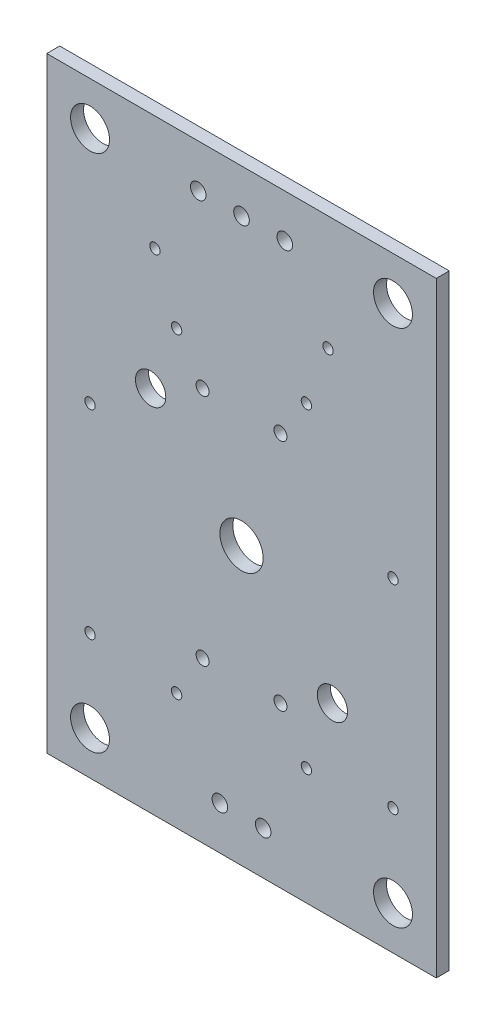
ISO-10303-21;
HEADER;
FILE_DESCRIPTION(('STEP AP214'),'2;1');
FILE_NAME('part.step','',(''),(''),'','','');
FILE_SCHEMA(('AUTOMOTIVE_DESIGN { 1 0 10303 214 1 1 1 1 }'));
ENDSEC;
DATA;
#1=APPLICATION_CONTEXT('core data for automotive mechanical design processes');
#2=APPLICATION_PROTOCOL_DEFINITION('international standard','automotive_design',2000,#1);
#3=PRODUCT_CONTEXT('',#1,'mechanical');
#4=PRODUCT('Part','Part','',(#3));
#5=PRODUCT_RELATED_PRODUCT_CATEGORY('part','',(#4));
#6=PRODUCT_DEFINITION_FORMATION('','',#4);
#7=PRODUCT_DEFINITION_CONTEXT('part definition',#1,'design');
#8=PRODUCT_DEFINITION('design','',#6,#7);
#9=PRODUCT_DEFINITION_SHAPE('','',#8);
#10=(LENGTH_UNIT() NAMED_UNIT(*) SI_UNIT(.MILLI.,.METRE.));
#11=(NAMED_UNIT(*) PLANE_ANGLE_UNIT() SI_UNIT($,.RADIAN.));
#12=(NAMED_UNIT(*) SI_UNIT($,.STERADIAN.) SOLID_ANGLE_UNIT());
#13=UNCERTAINTY_MEASURE_WITH_UNIT(LENGTH_MEASURE(1.E-05),#10,'distance_accuracy_value','');
#14=(GEOMETRIC_REPRESENTATION_CONTEXT(3) GLOBAL_UNCERTAINTY_ASSIGNED_CONTEXT((#13)) GLOBAL_UNIT_ASSIGNED_CONTEXT((#10,
#11,#12)) REPRESENTATION_CONTEXT('',''));
#15=CARTESIAN_POINT('',(0.,0.,0.));
#16=DIRECTION('',(0.,0.,1.));
#17=DIRECTION('',(1.,0.,0.));
#18=AXIS2_PLACEMENT_3D('',#15,#16,#17);
#19=CARTESIAN_POINT('',(-22.5,35.,1.5));
#20=DIRECTION('',(0.,0.,-1.));
#21=DIRECTION('',(-1.,0.,0.));
#22=AXIS2_PLACEMENT_3D('',#19,#20,#21);
#23=PLANE('',#22);
#24=CARTESIAN_POINT('',(9.99999999999999,21.75,1.5));
#25=DIRECTION('',(0.,0.,1.));
#26=DIRECTION('',(-1.,0.,0.));
#27=AXIS2_PLACEMENT_3D('',#24,#25,#26);
#28=CIRCLE('',#27,0.6);
#29=CARTESIAN_POINT('',(9.4,21.75,1.5));
#30=VERTEX_POINT('',#29);
#31=EDGE_CURVE('E262',#30,#30,#28,.T.);
#32=ORIENTED_EDGE('',*,*,#31,.F.);
#33=EDGE_LOOP('',(#32));
#34=FACE_BOUND('',#33,.T.);
#35=CARTESIAN_POINT('',(-9.99999999999999,21.75,1.5));
#36=DIRECTION('',(0.,0.,1.));
#37=DIRECTION('',(1.,0.,0.));
#38=AXIS2_PLACEMENT_3D('',#35,#36,#37);
#39=CIRCLE('',#38,0.6);
#40=CARTESIAN_POINT('',(-9.4,21.75,1.5));
#41=VERTEX_POINT('',#40);
#42=EDGE_CURVE('E256',#41,#41,#39,.T.);
#43=ORIENTED_EDGE('',*,*,#42,.F.);
#44=EDGE_LOOP('',(#43));
#45=FACE_BOUND('',#44,.T.);
#46=CARTESIAN_POINT('',(7.5,15.,1.5));
#47=DIRECTION('',(0.,0.,1.));
#48=DIRECTION('',(1.,0.,0.));
#49=AXIS2_PLACEMENT_3D('',#46,#47,#48);
#50=CIRCLE('',#49,0.6);
#51=CARTESIAN_POINT('',(8.1,15.,1.5));
#52=VERTEX_POINT('',#51);
#53=EDGE_CURVE('E250',#52,#52,#50,.T.);
#54=ORIENTED_EDGE('',*,*,#53,.F.);
#55=EDGE_LOOP('',(#54));
#56=FACE_BOUND('',#55,.T.);
#57=CARTESIAN_POINT('',(-7.5,15.,1.5));
#58=DIRECTION('',(0.,0.,1.));
#59=DIRECTION('',(1.,0.,0.));
#60=AXIS2_PLACEMENT_3D('',#57,#58,#59);
#61=CIRCLE('',#60,0.6);
#62=CARTESIAN_POINT('',(-6.9,15.,1.5));
#63=VERTEX_POINT('',#62);
#64=EDGE_CURVE('E244',#63,#63,#61,.T.);
#65=ORIENTED_EDGE('',*,*,#64,.F.);
#66=EDGE_LOOP('',(#65));
#67=FACE_BOUND('',#66,.T.);
#68=CARTESIAN_POINT('',(7.5,-21.5,1.5));
#69=DIRECTION('',(0.,0.,1.));
#70=DIRECTION('',(1.,0.,0.));
#71=AXIS2_PLACEMENT_3D('',#68,#69,#70);
#72=CIRCLE('',#71,0.6);
#73=CARTESIAN_POINT('',(8.1,-21.5,1.5));
#74=VERTEX_POINT('',#73);
#75=EDGE_CURVE('E238',#74,#74,#72,.T.);
#76=ORIENTED_EDGE('',*,*,#75,.F.);
#77=EDGE_LOOP('',(#76));
#78=FACE_BOUND('',#77,.T.);
#79=CARTESIAN_POINT('',(-7.5,-21.5,1.5));
#80=DIRECTION('',(0.,0.,1.));
#81=DIRECTION('',(1.,0.,0.));
#82=AXIS2_PLACEMENT_3D('',#79,#80,#81);
#83=CIRCLE('',#82,0.6);
#84=CARTESIAN_POINT('',(-6.9,-21.5,1.5));
#85=VERTEX_POINT('',#84);
#86=EDGE_CURVE('E232',#85,#85,#83,.T.);
#87=ORIENTED_EDGE('',*,*,#86,.F.);
#88=EDGE_LOOP('',(#87));
#89=FACE_BOUND('',#88,.T.);
#90=CARTESIAN_POINT('',(17.5,-20.5,1.5));
#91=DIRECTION('',(0.,0.,1.));
#92=DIRECTION('',(-1.,0.,0.));
#93=AXIS2_PLACEMENT_3D('',#90,#91,#92);
#94=CIRCLE('',#93,0.6);
#95=CARTESIAN_POINT('',(16.9,-20.5,1.5));
#96=VERTEX_POINT('',#95);
#97=EDGE_CURVE('E226',#96,#96,#94,.T.);
#98=ORIENTED_EDGE('',*,*,#97,.F.);
#99=EDGE_LOOP('',(#98));
#100=FACE_BOUND('',#99,.T.);
#101=CARTESIAN_POINT('',(17.5,2.49999999999999,1.5));
#102=DIRECTION('',(0.,0.,1.));
#103=DIRECTION('',(-1.,0.,0.));
#104=AXIS2_PLACEMENT_3D('',#101,#102,#103);
#105=CIRCLE('',#104,0.6);
#106=CARTESIAN_POINT('',(16.9,2.49999999999999,1.5));
#107=VERTEX_POINT('',#106);
#108=EDGE_CURVE('E220',#107,#107,#105,.T.);
#109=ORIENTED_EDGE('',*,*,#108,.F.);
#110=EDGE_LOOP('',(#109));
#111=FACE_BOUND('',#110,.T.);
#112=CARTESIAN_POINT('',(-17.5,2.5,1.5));
#113=DIRECTION('',(0.,0.,1.));
#114=DIRECTION('',(1.,0.,0.));
#115=AXIS2_PLACEMENT_3D('',#112,#113,#114);
#116=CIRCLE('',#115,0.6);
#117=CARTESIAN_POINT('',(-16.9,2.5,1.5));
#118=VERTEX_POINT('',#117);
#119=EDGE_CURVE('E214',#118,#118,#116,.T.);
#120=ORIENTED_EDGE('',*,*,#119,.F.);
#121=EDGE_LOOP('',(#120));
#122=FACE_BOUND('',#121,.T.);
#123=CARTESIAN_POINT('',(-17.5,-20.5,1.5));
#124=DIRECTION('',(0.,0.,1.));
#125=DIRECTION('',(1.,0.,0.));
#126=AXIS2_PLACEMENT_3D('',#123,#124,#125);
#127=CIRCLE('',#126,0.6);
#128=CARTESIAN_POINT('',(-16.9,-20.5,1.5));
#129=VERTEX_POINT('',#128);
#130=EDGE_CURVE('E208',#129,#129,#127,.T.);
#131=ORIENTED_EDGE('',*,*,#130,.F.);
#132=EDGE_LOOP('',(#131));
#133=FACE_BOUND('',#132,.T.);
#134=CARTESIAN_POINT('',(4.5,-16.5,1.5));
#135=DIRECTION('',(0.,0.,1.));
#136=DIRECTION('',(-1.,0.,0.));
#137=AXIS2_PLACEMENT_3D('',#134,#135,#136);
#138=CIRCLE('',#137,0.75);
#139=CARTESIAN_POINT('',(3.75,-16.5,1.5));
#140=VERTEX_POINT('',#139);
#141=EDGE_CURVE('E193',#140,#140,#138,.T.);
#142=ORIENTED_EDGE('',*,*,#141,.F.);
#143=EDGE_LOOP('',(#142));
#144=FACE_BOUND('',#143,.T.);
#145=CARTESIAN_POINT('',(2.5,-30.,1.5));
#146=DIRECTION('',(0.,0.,1.));
#147=DIRECTION('',(1.,0.,0.));
#148=AXIS2_PLACEMENT_3D('',#145,#146,#147);
#149=CIRCLE('',#148,0.9);
#150=CARTESIAN_POINT('',(3.4,-30.,1.5));
#151=VERTEX_POINT('',#150);
#152=EDGE_CURVE('E181',#151,#151,#149,.T.);
#153=ORIENTED_EDGE('',*,*,#152,.F.);
#154=EDGE_LOOP('',(#153));
#155=FACE_BOUND('',#154,.T.);
#156=CARTESIAN_POINT('',(5.,30.,1.5));
#157=DIRECTION('',(0.,0.,1.));
#158=DIRECTION('',(1.,0.,0.));
#159=AXIS2_PLACEMENT_3D('',#156,#157,#158);
#160=CIRCLE('',#159,0.9);
#161=CARTESIAN_POINT('',(5.9,30.,1.5));
#162=VERTEX_POINT('',#161);
#163=EDGE_CURVE('E169',#162,#162,#160,.T.);
#164=ORIENTED_EDGE('',*,*,#163,.F.);
#165=EDGE_LOOP('',(#164));
#166=FACE_BOUND('',#165,.T.);
#167=CARTESIAN_POINT('',(-2.5,-30.,1.5));
#168=DIRECTION('',(0.,0.,1.));
#169=DIRECTION('',(1.,0.,0.));
#170=AXIS2_PLACEMENT_3D('',#167,#168,#169);
#171=CIRCLE('',#170,0.9);
#172=CARTESIAN_POINT('',(-1.6,-30.,1.5));
#173=VERTEX_POINT('',#172);
#174=EDGE_CURVE('E157',#173,#173,#171,.T.);
#175=ORIENTED_EDGE('',*,*,#174,.F.);
#176=EDGE_LOOP('',(#175));
#177=FACE_BOUND('',#176,.T.);
#178=CARTESIAN_POINT('',(10.5,-13.5,1.5));
#179=DIRECTION('',(0.,0.,1.));
#180=DIRECTION('',(1.,0.,0.));
#181=AXIS2_PLACEMENT_3D('',#178,#179,#180);
#182=CIRCLE('',#181,1.75);
#183=CARTESIAN_POINT('',(12.25,-13.5,1.5));
#184=VERTEX_POINT('',#183);
#185=EDGE_CURVE('E145',#184,#184,#182,.T.);
#186=ORIENTED_EDGE('',*,*,#185,.F.);
#187=EDGE_LOOP('',(#186));
#188=FACE_BOUND('',#187,.T.);
#189=CARTESIAN_POINT('',(0.,-3.,1.5));
#190=DIRECTION('',(0.,0.,1.));
#191=DIRECTION('',(1.,0.,0.));
#192=AXIS2_PLACEMENT_3D('',#189,#190,#191);
#193=CIRCLE('',#192,2.5);
#194=CARTESIAN_POINT('',(2.5,-3.,1.5));
#195=VERTEX_POINT('',#194);
#196=EDGE_CURVE('E133',#195,#195,#193,.T.);
#197=ORIENTED_EDGE('',*,*,#196,.F.);
#198=EDGE_LOOP('',(#197));
#199=FACE_BOUND('',#198,.T.);
#200=CARTESIAN_POINT('',(17.5,-30.,1.5));
#201=DIRECTION('',(0.,0.,1.));
#202=DIRECTION('',(1.,0.,0.));
#203=AXIS2_PLACEMENT_3D('',#200,#201,#202);
#204=CIRCLE('',#203,2.25);
#205=CARTESIAN_POINT('',(19.75,-30.,1.5));
#206=VERTEX_POINT('',#205);
#207=EDGE_CURVE('E121',#206,#206,#204,.T.);
#208=ORIENTED_EDGE('',*,*,#207,.F.);
#209=EDGE_LOOP('',(#208));
#210=FACE_BOUND('',#209,.T.);
#211=CARTESIAN_POINT('',(-17.5,30.,1.5));
#212=DIRECTION('',(0.,0.,1.));
#213=DIRECTION('',(1.,0.,0.));
#214=AXIS2_PLACEMENT_3D('',#211,#212,#213);
#215=CIRCLE('',#214,2.25);
#216=CARTESIAN_POINT('',(-15.25,30.,1.5));
#217=VERTEX_POINT('',#216);
#218=EDGE_CURVE('E100',#217,#217,#215,.T.);
#219=ORIENTED_EDGE('',*,*,#218,.F.);
#220=EDGE_LOOP('',(#219));
#221=FACE_BOUND('',#220,.T.);
#222=DIRECTION('',(0.,-1.,0.));
#223=VECTOR('',#222,1.);
#224=CARTESIAN_POINT('',(-22.5,-35.,1.5));
#225=LINE('',#224,#223);
#226=CARTESIAN_POINT('',(-22.5,35.,1.5));
#227=VERTEX_POINT('',#226);
#228=CARTESIAN_POINT('',(-22.5,-35.,1.5));
#229=VERTEX_POINT('',#228);
#230=EDGE_CURVE('E85',#227,#229,#225,.T.);
#231=ORIENTED_EDGE('',*,*,#230,.T.);
#232=DIRECTION('',(1.,0.,0.));
#233=VECTOR('',#232,1.);
#234=CARTESIAN_POINT('',(-22.5,-35.,1.5));
#235=LINE('',#234,#233);
#236=CARTESIAN_POINT('',(22.5,-35.,1.5));
#237=VERTEX_POINT('',#236);
#238=EDGE_CURVE('E80',#229,#237,#235,.T.);
#239=ORIENTED_EDGE('',*,*,#238,.T.);
#240=DIRECTION('',(0.,1.,0.));
#241=VECTOR('',#240,1.);
#242=CARTESIAN_POINT('',(22.5,-35.,1.5));
#243=LINE('',#242,#241);
#244=CARTESIAN_POINT('',(22.5,35.,1.5));
#245=VERTEX_POINT('',#244);
#246=EDGE_CURVE('E83',#237,#245,#243,.T.);
#247=ORIENTED_EDGE('',*,*,#246,.T.);
#248=DIRECTION('',(-1.,0.,0.));
#249=VECTOR('',#248,1.);
#250=CARTESIAN_POINT('',(-22.5,35.,1.5));
#251=LINE('',#250,#249);
#252=EDGE_CURVE('E50',#245,#227,#251,.T.);
#253=ORIENTED_EDGE('',*,*,#252,.T.);
#254=EDGE_LOOP('',(#231,#239,#247,#253));
#255=FACE_BOUND('',#254,.T.);
#256=CARTESIAN_POINT('',(17.5,30.,1.5));
#257=DIRECTION('',(0.,0.,1.));
#258=DIRECTION('',(-1.,0.,0.));
#259=AXIS2_PLACEMENT_3D('',#256,#257,#258);
#260=CIRCLE('',#259,2.25);
#261=CARTESIAN_POINT('',(15.25,30.,1.5));
#262=VERTEX_POINT('',#261);
#263=EDGE_CURVE('E115',#262,#262,#260,.T.);
#264=ORIENTED_EDGE('',*,*,#263,.F.);
#265=EDGE_LOOP('',(#264));
#266=FACE_BOUND('',#265,.T.);
#267=CARTESIAN_POINT('',(-17.5,-30.,1.5));
#268=DIRECTION('',(0.,0.,1.));
#269=DIRECTION('',(-1.,0.,0.));
#270=AXIS2_PLACEMENT_3D('',#267,#268,#269);
#271=CIRCLE('',#270,2.25);
#272=CARTESIAN_POINT('',(-19.75,-30.,1.5));
#273=VERTEX_POINT('',#272);
#274=EDGE_CURVE('E127',#273,#273,#271,.T.);
#275=ORIENTED_EDGE('',*,*,#274,.F.);
#276=EDGE_LOOP('',(#275));
#277=FACE_BOUND('',#276,.T.);
#278=CARTESIAN_POINT('',(-10.5,7.5,1.5));
#279=DIRECTION('',(0.,0.,1.));
#280=DIRECTION('',(1.,0.,0.));
#281=AXIS2_PLACEMENT_3D('',#278,#279,#280);
#282=CIRCLE('',#281,1.75);
#283=CARTESIAN_POINT('',(-8.75,7.5,1.5));
#284=VERTEX_POINT('',#283);
#285=EDGE_CURVE('E139',#284,#284,#282,.T.);
#286=ORIENTED_EDGE('',*,*,#285,.F.);
#287=EDGE_LOOP('',(#286));
#288=FACE_BOUND('',#287,.T.);
#289=CARTESIAN_POINT('',(-5.,30.,1.5));
#290=DIRECTION('',(0.,0.,1.));
#291=DIRECTION('',(1.,0.,0.));
#292=AXIS2_PLACEMENT_3D('',#289,#290,#291);
#293=CIRCLE('',#292,0.9);
#294=CARTESIAN_POINT('',(-4.1,30.,1.5));
#295=VERTEX_POINT('',#294);
#296=EDGE_CURVE('E151',#295,#295,#293,.T.);
#297=ORIENTED_EDGE('',*,*,#296,.F.);
#298=EDGE_LOOP('',(#297));
#299=FACE_BOUND('',#298,.T.);
#300=CARTESIAN_POINT('',(0.,30.,1.5));
#301=DIRECTION('',(0.,0.,1.));
#302=DIRECTION('',(1.,0.,0.));
#303=AXIS2_PLACEMENT_3D('',#300,#301,#302);
#304=CIRCLE('',#303,0.9);
#305=CARTESIAN_POINT('',(0.900000000000002,30.,1.5));
#306=VERTEX_POINT('',#305);
#307=EDGE_CURVE('E163',#306,#306,#304,.T.);
#308=ORIENTED_EDGE('',*,*,#307,.F.);
#309=EDGE_LOOP('',(#308));
#310=FACE_BOUND('',#309,.T.);
#311=CARTESIAN_POINT('',(-4.5,-16.5,1.5));
#312=DIRECTION('',(0.,0.,1.));
#313=DIRECTION('',(1.,0.,0.));
#314=AXIS2_PLACEMENT_3D('',#311,#312,#313);
#315=CIRCLE('',#314,0.75);
#316=CARTESIAN_POINT('',(-3.75,-16.5,1.5));
#317=VERTEX_POINT('',#316);
#318=EDGE_CURVE('E175',#317,#317,#315,.T.);
#319=ORIENTED_EDGE('',*,*,#318,.F.);
#320=EDGE_LOOP('',(#319));
#321=FACE_BOUND('',#320,.T.);
#322=CARTESIAN_POINT('',(-4.5,10.5,1.5));
#323=DIRECTION('',(0.,0.,1.));
#324=DIRECTION('',(1.,0.,0.));
#325=AXIS2_PLACEMENT_3D('',#322,#323,#324);
#326=CIRCLE('',#325,0.75);
#327=CARTESIAN_POINT('',(-3.75,10.5,1.5));
#328=VERTEX_POINT('',#327);
#329=EDGE_CURVE('E187',#328,#328,#326,.T.);
#330=ORIENTED_EDGE('',*,*,#329,.F.);
#331=EDGE_LOOP('',(#330));
#332=FACE_BOUND('',#331,.T.);
#333=CARTESIAN_POINT('',(4.5,10.5,1.5));
#334=DIRECTION('',(0.,0.,1.));
#335=DIRECTION('',(-1.,0.,0.));
#336=AXIS2_PLACEMENT_3D('',#333,#334,#335);
#337=CIRCLE('',#336,0.75);
#338=CARTESIAN_POINT('',(3.75,10.5,1.5));
#339=VERTEX_POINT('',#338);
#340=EDGE_CURVE('E199',#339,#339,#337,.T.);
#341=ORIENTED_EDGE('',*,*,#340,.F.);
#342=EDGE_LOOP('',(#341));
#343=FACE_BOUND('',#342,.T.);
#344=ADVANCED_FACE('F33',(#34,#45,#56,#67,#78,#89,#100,#111,#122,#133,#144,#155,#166,#177,#188,
#199,#210,#221,#255,#266,#277,#288,#299,#310,#321,#332,#343),#23,.F.);
#345=CARTESIAN_POINT('',(-22.5,35.,0.));
#346=DIRECTION('',(0.,0.,-1.));
#347=DIRECTION('',(-1.,0.,0.));
#348=AXIS2_PLACEMENT_3D('',#345,#346,#347);
#349=PLANE('',#348);
#350=CARTESIAN_POINT('',(9.99999999999999,21.75,0.));
#351=DIRECTION('',(0.,0.,1.));
#352=DIRECTION('',(-1.,0.,0.));
#353=AXIS2_PLACEMENT_3D('',#350,#351,#352);
#354=CIRCLE('',#353,0.6);
#355=CARTESIAN_POINT('',(9.4,21.75,0.));
#356=VERTEX_POINT('',#355);
#357=EDGE_CURVE('E259',#356,#356,#354,.T.);
#358=ORIENTED_EDGE('',*,*,#357,.T.);
#359=EDGE_LOOP('',(#358));
#360=FACE_BOUND('',#359,.T.);
#361=CARTESIAN_POINT('',(-9.99999999999999,21.75,0.));
#362=DIRECTION('',(0.,0.,1.));
#363=DIRECTION('',(1.,0.,0.));
#364=AXIS2_PLACEMENT_3D('',#361,#362,#363);
#365=CIRCLE('',#364,0.6);
#366=CARTESIAN_POINT('',(-9.4,21.75,0.));
#367=VERTEX_POINT('',#366);
#368=EDGE_CURVE('E253',#367,#367,#365,.T.);
#369=ORIENTED_EDGE('',*,*,#368,.T.);
#370=EDGE_LOOP('',(#369));
#371=FACE_BOUND('',#370,.T.);
#372=CARTESIAN_POINT('',(7.5,15.,0.));
#373=DIRECTION('',(0.,0.,1.));
#374=DIRECTION('',(1.,0.,0.));
#375=AXIS2_PLACEMENT_3D('',#372,#373,#374);
#376=CIRCLE('',#375,0.6);
#377=CARTESIAN_POINT('',(8.1,15.,0.));
#378=VERTEX_POINT('',#377);
#379=EDGE_CURVE('E247',#378,#378,#376,.T.);
#380=ORIENTED_EDGE('',*,*,#379,.T.);
#381=EDGE_LOOP('',(#380));
#382=FACE_BOUND('',#381,.T.);
#383=CARTESIAN_POINT('',(-7.5,15.,0.));
#384=DIRECTION('',(0.,0.,1.));
#385=DIRECTION('',(1.,0.,0.));
#386=AXIS2_PLACEMENT_3D('',#383,#384,#385);
#387=CIRCLE('',#386,0.6);
#388=CARTESIAN_POINT('',(-6.9,15.,0.));
#389=VERTEX_POINT('',#388);
#390=EDGE_CURVE('E241',#389,#389,#387,.T.);
#391=ORIENTED_EDGE('',*,*,#390,.T.);
#392=EDGE_LOOP('',(#391));
#393=FACE_BOUND('',#392,.T.);
#394=CARTESIAN_POINT('',(7.5,-21.5,0.));
#395=DIRECTION('',(0.,0.,1.));
#396=DIRECTION('',(1.,0.,0.));
#397=AXIS2_PLACEMENT_3D('',#394,#395,#396);
#398=CIRCLE('',#397,0.6);
#399=CARTESIAN_POINT('',(8.1,-21.5,0.));
#400=VERTEX_POINT('',#399);
#401=EDGE_CURVE('E235',#400,#400,#398,.T.);
#402=ORIENTED_EDGE('',*,*,#401,.T.);
#403=EDGE_LOOP('',(#402));
#404=FACE_BOUND('',#403,.T.);
#405=CARTESIAN_POINT('',(-7.5,-21.5,0.));
#406=DIRECTION('',(0.,0.,1.));
#407=DIRECTION('',(1.,0.,0.));
#408=AXIS2_PLACEMENT_3D('',#405,#406,#407);
#409=CIRCLE('',#408,0.6);
#410=CARTESIAN_POINT('',(-6.9,-21.5,0.));
#411=VERTEX_POINT('',#410);
#412=EDGE_CURVE('E229',#411,#411,#409,.T.);
#413=ORIENTED_EDGE('',*,*,#412,.T.);
#414=EDGE_LOOP('',(#413));
#415=FACE_BOUND('',#414,.T.);
#416=CARTESIAN_POINT('',(17.5,-20.5,0.));
#417=DIRECTION('',(0.,0.,1.));
#418=DIRECTION('',(-1.,0.,0.));
#419=AXIS2_PLACEMENT_3D('',#416,#417,#418);
#420=CIRCLE('',#419,0.6);
#421=CARTESIAN_POINT('',(16.9,-20.5,0.));
#422=VERTEX_POINT('',#421);
#423=EDGE_CURVE('E223',#422,#422,#420,.T.);
#424=ORIENTED_EDGE('',*,*,#423,.T.);
#425=EDGE_LOOP('',(#424));
#426=FACE_BOUND('',#425,.T.);
#427=CARTESIAN_POINT('',(17.5,2.49999999999999,0.));
#428=DIRECTION('',(0.,0.,1.));
#429=DIRECTION('',(-1.,0.,0.));
#430=AXIS2_PLACEMENT_3D('',#427,#428,#429);
#431=CIRCLE('',#430,0.6);
#432=CARTESIAN_POINT('',(16.9,2.49999999999999,0.));
#433=VERTEX_POINT('',#432);
#434=EDGE_CURVE('E217',#433,#433,#431,.T.);
#435=ORIENTED_EDGE('',*,*,#434,.T.);
#436=EDGE_LOOP('',(#435));
#437=FACE_BOUND('',#436,.T.);
#438=CARTESIAN_POINT('',(-17.5,2.5,0.));
#439=DIRECTION('',(0.,0.,1.));
#440=DIRECTION('',(1.,0.,0.));
#441=AXIS2_PLACEMENT_3D('',#438,#439,#440);
#442=CIRCLE('',#441,0.6);
#443=CARTESIAN_POINT('',(-16.9,2.5,0.));
#444=VERTEX_POINT('',#443);
#445=EDGE_CURVE('E211',#444,#444,#442,.T.);
#446=ORIENTED_EDGE('',*,*,#445,.T.);
#447=EDGE_LOOP('',(#446));
#448=FACE_BOUND('',#447,.T.);
#449=CARTESIAN_POINT('',(-17.5,-20.5,0.));
#450=DIRECTION('',(0.,0.,1.));
#451=DIRECTION('',(1.,0.,0.));
#452=AXIS2_PLACEMENT_3D('',#449,#450,#451);
#453=CIRCLE('',#452,0.6);
#454=CARTESIAN_POINT('',(-16.9,-20.5,0.));
#455=VERTEX_POINT('',#454);
#456=EDGE_CURVE('E205',#455,#455,#453,.T.);
#457=ORIENTED_EDGE('',*,*,#456,.T.);
#458=EDGE_LOOP('',(#457));
#459=FACE_BOUND('',#458,.T.);
#460=CARTESIAN_POINT('',(4.5,-16.5,0.));
#461=DIRECTION('',(0.,0.,1.));
#462=DIRECTION('',(-1.,0.,0.));
#463=AXIS2_PLACEMENT_3D('',#460,#461,#462);
#464=CIRCLE('',#463,0.75);
#465=CARTESIAN_POINT('',(3.75,-16.5,0.));
#466=VERTEX_POINT('',#465);
#467=EDGE_CURVE('E196',#466,#466,#464,.T.);
#468=ORIENTED_EDGE('',*,*,#467,.T.);
#469=EDGE_LOOP('',(#468));
#470=FACE_BOUND('',#469,.T.);
#471=CARTESIAN_POINT('',(2.5,-30.,0.));
#472=DIRECTION('',(0.,0.,1.));
#473=DIRECTION('',(1.,0.,0.));
#474=AXIS2_PLACEMENT_3D('',#471,#472,#473);
#475=CIRCLE('',#474,0.9);
#476=CARTESIAN_POINT('',(3.4,-30.,0.));
#477=VERTEX_POINT('',#476);
#478=EDGE_CURVE('E184',#477,#477,#475,.T.);
#479=ORIENTED_EDGE('',*,*,#478,.T.);
#480=EDGE_LOOP('',(#479));
#481=FACE_BOUND('',#480,.T.);
#482=CARTESIAN_POINT('',(5.,30.,0.));
#483=DIRECTION('',(0.,0.,1.));
#484=DIRECTION('',(1.,0.,0.));
#485=AXIS2_PLACEMENT_3D('',#482,#483,#484);
#486=CIRCLE('',#485,0.9);
#487=CARTESIAN_POINT('',(5.9,30.,0.));
#488=VERTEX_POINT('',#487);
#489=EDGE_CURVE('E172',#488,#488,#486,.T.);
#490=ORIENTED_EDGE('',*,*,#489,.T.);
#491=EDGE_LOOP('',(#490));
#492=FACE_BOUND('',#491,.T.);
#493=CARTESIAN_POINT('',(-2.5,-30.,0.));
#494=DIRECTION('',(0.,0.,1.));
#495=DIRECTION('',(1.,0.,0.));
#496=AXIS2_PLACEMENT_3D('',#493,#494,#495);
#497=CIRCLE('',#496,0.9);
#498=CARTESIAN_POINT('',(-1.6,-30.,0.));
#499=VERTEX_POINT('',#498);
#500=EDGE_CURVE('E160',#499,#499,#497,.T.);
#501=ORIENTED_EDGE('',*,*,#500,.T.);
#502=EDGE_LOOP('',(#501));
#503=FACE_BOUND('',#502,.T.);
#504=CARTESIAN_POINT('',(10.5,-13.5,0.));
#505=DIRECTION('',(0.,0.,1.));
#506=DIRECTION('',(1.,0.,0.));
#507=AXIS2_PLACEMENT_3D('',#504,#505,#506);
#508=CIRCLE('',#507,1.75);
#509=CARTESIAN_POINT('',(12.25,-13.5,0.));
#510=VERTEX_POINT('',#509);
#511=EDGE_CURVE('E148',#510,#510,#508,.T.);
#512=ORIENTED_EDGE('',*,*,#511,.T.);
#513=EDGE_LOOP('',(#512));
#514=FACE_BOUND('',#513,.T.);
#515=CARTESIAN_POINT('',(0.,-3.,0.));
#516=DIRECTION('',(0.,0.,1.));
#517=DIRECTION('',(1.,0.,0.));
#518=AXIS2_PLACEMENT_3D('',#515,#516,#517);
#519=CIRCLE('',#518,2.5);
#520=CARTESIAN_POINT('',(2.5,-3.,0.));
#521=VERTEX_POINT('',#520);
#522=EDGE_CURVE('E136',#521,#521,#519,.T.);
#523=ORIENTED_EDGE('',*,*,#522,.T.);
#524=EDGE_LOOP('',(#523));
#525=FACE_BOUND('',#524,.T.);
#526=CARTESIAN_POINT('',(17.5,-30.,0.));
#527=DIRECTION('',(0.,0.,1.));
#528=DIRECTION('',(1.,0.,0.));
#529=AXIS2_PLACEMENT_3D('',#526,#527,#528);
#530=CIRCLE('',#529,2.25);
#531=CARTESIAN_POINT('',(19.75,-30.,0.));
#532=VERTEX_POINT('',#531);
#533=EDGE_CURVE('E124',#532,#532,#530,.T.);
#534=ORIENTED_EDGE('',*,*,#533,.T.);
#535=EDGE_LOOP('',(#534));
#536=FACE_BOUND('',#535,.T.);
#537=CARTESIAN_POINT('',(-17.5,30.,0.));
#538=DIRECTION('',(0.,0.,1.));
#539=DIRECTION('',(1.,0.,0.));
#540=AXIS2_PLACEMENT_3D('',#537,#538,#539);
#541=CIRCLE('',#540,2.25);
#542=CARTESIAN_POINT('',(-15.25,30.,0.));
#543=VERTEX_POINT('',#542);
#544=EDGE_CURVE('E112',#543,#543,#541,.T.);
#545=ORIENTED_EDGE('',*,*,#544,.T.);
#546=EDGE_LOOP('',(#545));
#547=FACE_BOUND('',#546,.T.);
#548=DIRECTION('',(0.,-1.,0.));
#549=VECTOR('',#548,1.);
#550=CARTESIAN_POINT('',(-22.5,-35.,0.));
#551=LINE('',#550,#549);
#552=CARTESIAN_POINT('',(-22.5,35.,0.));
#553=VERTEX_POINT('',#552);
#554=CARTESIAN_POINT('',(-22.5,-35.,0.));
#555=VERTEX_POINT('',#554);
#556=EDGE_CURVE('E97',#553,#555,#551,.T.);
#557=ORIENTED_EDGE('',*,*,#556,.F.);
#558=DIRECTION('',(-1.,0.,0.));
#559=VECTOR('',#558,1.);
#560=CARTESIAN_POINT('',(-22.5,35.,0.));
#561=LINE('',#560,#559);
#562=CARTESIAN_POINT('',(22.5,35.,0.));
#563=VERTEX_POINT('',#562);
#564=EDGE_CURVE('E73',#563,#553,#561,.T.);
#565=ORIENTED_EDGE('',*,*,#564,.F.);
#566=DIRECTION('',(0.,1.,0.));
#567=VECTOR('',#566,1.);
#568=CARTESIAN_POINT('',(22.5,-35.,0.));
#569=LINE('',#568,#567);
#570=CARTESIAN_POINT('',(22.5,-35.,0.));
#571=VERTEX_POINT('',#570);
#572=EDGE_CURVE('E67',#571,#563,#569,.T.);
#573=ORIENTED_EDGE('',*,*,#572,.F.);
#574=DIRECTION('',(1.,0.,0.));
#575=VECTOR('',#574,1.);
#576=CARTESIAN_POINT('',(-22.5,-35.,0.));
#577=LINE('',#576,#575);
#578=EDGE_CURVE('E89',#555,#571,#577,.T.);
#579=ORIENTED_EDGE('',*,*,#578,.F.);
#580=EDGE_LOOP('',(#557,#565,#573,#579));
#581=FACE_BOUND('',#580,.T.);
#582=CARTESIAN_POINT('',(17.5,30.,0.));
#583=DIRECTION('',(0.,0.,1.));
#584=DIRECTION('',(-1.,0.,0.));
#585=AXIS2_PLACEMENT_3D('',#582,#583,#584);
#586=CIRCLE('',#585,2.25);
#587=CARTESIAN_POINT('',(15.25,30.,0.));
#588=VERTEX_POINT('',#587);
#589=EDGE_CURVE('E118',#588,#588,#586,.T.);
#590=ORIENTED_EDGE('',*,*,#589,.T.);
#591=EDGE_LOOP('',(#590));
#592=FACE_BOUND('',#591,.T.);
#593=CARTESIAN_POINT('',(-17.5,-30.,0.));
#594=DIRECTION('',(0.,0.,1.));
#595=DIRECTION('',(-1.,0.,0.));
#596=AXIS2_PLACEMENT_3D('',#593,#594,#595);
#597=CIRCLE('',#596,2.25);
#598=CARTESIAN_POINT('',(-19.75,-30.,0.));
#599=VERTEX_POINT('',#598);
#600=EDGE_CURVE('E130',#599,#599,#597,.T.);
#601=ORIENTED_EDGE('',*,*,#600,.T.);
#602=EDGE_LOOP('',(#601));
#603=FACE_BOUND('',#602,.T.);
#604=CARTESIAN_POINT('',(-10.5,7.5,0.));
#605=DIRECTION('',(0.,0.,1.));
#606=DIRECTION('',(1.,0.,0.));
#607=AXIS2_PLACEMENT_3D('',#604,#605,#606);
#608=CIRCLE('',#607,1.75);
#609=CARTESIAN_POINT('',(-8.75,7.5,0.));
#610=VERTEX_POINT('',#609);
#611=EDGE_CURVE('E142',#610,#610,#608,.T.);
#612=ORIENTED_EDGE('',*,*,#611,.T.);
#613=EDGE_LOOP('',(#612));
#614=FACE_BOUND('',#613,.T.);
#615=CARTESIAN_POINT('',(-5.,30.,0.));
#616=DIRECTION('',(0.,0.,1.));
#617=DIRECTION('',(1.,0.,0.));
#618=AXIS2_PLACEMENT_3D('',#615,#616,#617);
#619=CIRCLE('',#618,0.9);
#620=CARTESIAN_POINT('',(-4.1,30.,0.));
#621=VERTEX_POINT('',#620);
#622=EDGE_CURVE('E154',#621,#621,#619,.T.);
#623=ORIENTED_EDGE('',*,*,#622,.T.);
#624=EDGE_LOOP('',(#623));
#625=FACE_BOUND('',#624,.T.);
#626=CARTESIAN_POINT('',(0.,30.,0.));
#627=DIRECTION('',(0.,0.,1.));
#628=DIRECTION('',(1.,0.,0.));
#629=AXIS2_PLACEMENT_3D('',#626,#627,#628);
#630=CIRCLE('',#629,0.9);
#631=CARTESIAN_POINT('',(0.900000000000002,30.,0.));
#632=VERTEX_POINT('',#631);
#633=EDGE_CURVE('E166',#632,#632,#630,.T.);
#634=ORIENTED_EDGE('',*,*,#633,.T.);
#635=EDGE_LOOP('',(#634));
#636=FACE_BOUND('',#635,.T.);
#637=CARTESIAN_POINT('',(-4.5,-16.5,0.));
#638=DIRECTION('',(0.,0.,1.));
#639=DIRECTION('',(1.,0.,0.));
#640=AXIS2_PLACEMENT_3D('',#637,#638,#639);
#641=CIRCLE('',#640,0.75);
#642=CARTESIAN_POINT('',(-3.75,-16.5,0.));
#643=VERTEX_POINT('',#642);
#644=EDGE_CURVE('E178',#643,#643,#641,.T.);
#645=ORIENTED_EDGE('',*,*,#644,.T.);
#646=EDGE_LOOP('',(#645));
#647=FACE_BOUND('',#646,.T.);
#648=CARTESIAN_POINT('',(-4.5,10.5,0.));
#649=DIRECTION('',(0.,0.,1.));
#650=DIRECTION('',(1.,0.,0.));
#651=AXIS2_PLACEMENT_3D('',#648,#649,#650);
#652=CIRCLE('',#651,0.75);
#653=CARTESIAN_POINT('',(-3.75,10.5,0.));
#654=VERTEX_POINT('',#653);
#655=EDGE_CURVE('E190',#654,#654,#652,.T.);
#656=ORIENTED_EDGE('',*,*,#655,.T.);
#657=EDGE_LOOP('',(#656));
#658=FACE_BOUND('',#657,.T.);
#659=CARTESIAN_POINT('',(4.5,10.5,0.));
#660=DIRECTION('',(0.,0.,1.));
#661=DIRECTION('',(-1.,0.,0.));
#662=AXIS2_PLACEMENT_3D('',#659,#660,#661);
#663=CIRCLE('',#662,0.75);
#664=CARTESIAN_POINT('',(3.75,10.5,0.));
#665=VERTEX_POINT('',#664);
#666=EDGE_CURVE('E202',#665,#665,#663,.T.);
#667=ORIENTED_EDGE('',*,*,#666,.T.);
#668=EDGE_LOOP('',(#667));
#669=FACE_BOUND('',#668,.T.);
#670=ADVANCED_FACE('F108',(#360,#371,#382,#393,#404,#415,#426,#437,#448,#459,#470,#481,#492,
#503,#514,#525,#536,#547,#581,#592,#603,#614,#625,#636,#647,#658,#669),#349,.T.);
#671=CARTESIAN_POINT('',(-22.5,-35.,1.5));
#672=DIRECTION('',(1.,0.,0.));
#673=DIRECTION('',(0.,1.,0.));
#674=AXIS2_PLACEMENT_3D('',#671,#672,#673);
#675=PLANE('',#674);
#676=ORIENTED_EDGE('',*,*,#556,.T.);
#677=DIRECTION('',(0.,0.,-1.));
#678=VECTOR('',#677,1.);
#679=CARTESIAN_POINT('',(-22.5,-35.,1.5));
#680=LINE('',#679,#678);
#681=EDGE_CURVE('E11',#229,#555,#680,.T.);
#682=ORIENTED_EDGE('',*,*,#681,.F.);
#683=ORIENTED_EDGE('',*,*,#230,.F.);
#684=DIRECTION('',(0.,0.,-1.));
#685=VECTOR('',#684,1.);
#686=CARTESIAN_POINT('',(-22.5,35.,1.5));
#687=LINE('',#686,#685);
#688=EDGE_CURVE('E93',#227,#553,#687,.T.);
#689=ORIENTED_EDGE('',*,*,#688,.T.);
#690=EDGE_LOOP('',(#676,#682,#683,#689));
#691=FACE_BOUND('',#690,.T.);
#692=ADVANCED_FACE('F35',(#691),#675,.F.);
#693=CARTESIAN_POINT('',(-22.5,-35.,1.5));
#694=DIRECTION('',(0.,1.,0.));
#695=DIRECTION('',(0.,0.,1.));
#696=AXIS2_PLACEMENT_3D('',#693,#694,#695);
#697=PLANE('',#696);
#698=ORIENTED_EDGE('',*,*,#578,.T.);
#699=DIRECTION('',(0.,0.,-1.));
#700=VECTOR('',#699,1.);
#701=CARTESIAN_POINT('',(22.5,-35.,1.5));
#702=LINE('',#701,#700);
#703=EDGE_CURVE('E42',#237,#571,#702,.T.);
#704=ORIENTED_EDGE('',*,*,#703,.F.);
#705=ORIENTED_EDGE('',*,*,#238,.F.);
#706=ORIENTED_EDGE('',*,*,#681,.T.);
#707=EDGE_LOOP('',(#698,#704,#705,#706));
#708=FACE_BOUND('',#707,.T.);
#709=ADVANCED_FACE('F88',(#708),#697,.F.);
#710=CARTESIAN_POINT('',(22.5,-35.,1.5));
#711=DIRECTION('',(-1.,0.,0.));
#712=DIRECTION('',(0.,-1.,0.));
#713=AXIS2_PLACEMENT_3D('',#710,#711,#712);
#714=PLANE('',#713);
#715=ORIENTED_EDGE('',*,*,#572,.T.);
#716=DIRECTION('',(0.,0.,-1.));
#717=VECTOR('',#716,1.);
#718=CARTESIAN_POINT('',(22.5,35.,1.5));
#719=LINE('',#718,#717);
#720=EDGE_CURVE('E90',#245,#563,#719,.T.);
#721=ORIENTED_EDGE('',*,*,#720,.F.);
#722=ORIENTED_EDGE('',*,*,#246,.F.);
#723=ORIENTED_EDGE('',*,*,#703,.T.);
#724=EDGE_LOOP('',(#715,#721,#722,#723));
#725=FACE_BOUND('',#724,.T.);
#726=ADVANCED_FACE('F91',(#725),#714,.F.);
#727=CARTESIAN_POINT('',(-22.5,35.,1.5));
#728=DIRECTION('',(0.,-1.,0.));
#729=DIRECTION('',(0.,0.,-1.));
#730=AXIS2_PLACEMENT_3D('',#727,#728,#729);
#731=PLANE('',#730);
#732=ORIENTED_EDGE('',*,*,#564,.T.);
#733=ORIENTED_EDGE('',*,*,#688,.F.);
#734=ORIENTED_EDGE('',*,*,#252,.F.);
#735=ORIENTED_EDGE('',*,*,#720,.T.);
#736=EDGE_LOOP('',(#732,#733,#734,#735));
#737=FACE_BOUND('',#736,.T.);
#738=ADVANCED_FACE('F105',(#737),#731,.F.);
#739=CARTESIAN_POINT('',(-17.5,30.,1.5));
#740=DIRECTION('',(0.,0.,-1.));
#741=DIRECTION('',(-1.,0.,0.));
#742=AXIS2_PLACEMENT_3D('',#739,#740,#741);
#743=CYLINDRICAL_SURFACE('',#742,2.25);
#744=ORIENTED_EDGE('',*,*,#218,.T.);
#745=EDGE_LOOP('',(#744));
#746=FACE_BOUND('',#745,.T.);
#747=ORIENTED_EDGE('',*,*,#544,.F.);
#748=EDGE_LOOP('',(#747));
#749=FACE_BOUND('',#748,.T.);
#750=ADVANCED_FACE('F314',(#746,#749),#743,.F.);
#751=CARTESIAN_POINT('',(17.5,30.,1.5));
#752=DIRECTION('',(0.,0.,-1.));
#753=DIRECTION('',(-1.,0.,0.));
#754=AXIS2_PLACEMENT_3D('',#751,#752,#753);
#755=CYLINDRICAL_SURFACE('',#754,2.25);
#756=ORIENTED_EDGE('',*,*,#263,.T.);
#757=EDGE_LOOP('',(#756));
#758=FACE_BOUND('',#757,.T.);
#759=ORIENTED_EDGE('',*,*,#589,.F.);
#760=EDGE_LOOP('',(#759));
#761=FACE_BOUND('',#760,.T.);
#762=ADVANCED_FACE('F317',(#758,#761),#755,.F.);
#763=CARTESIAN_POINT('',(17.5,-30.,1.5));
#764=DIRECTION('',(0.,0.,-1.));
#765=DIRECTION('',(-1.,0.,0.));
#766=AXIS2_PLACEMENT_3D('',#763,#764,#765);
#767=CYLINDRICAL_SURFACE('',#766,2.25);
#768=ORIENTED_EDGE('',*,*,#207,.T.);
#769=EDGE_LOOP('',(#768));
#770=FACE_BOUND('',#769,.T.);
#771=ORIENTED_EDGE('',*,*,#533,.F.);
#772=EDGE_LOOP('',(#771));
#773=FACE_BOUND('',#772,.T.);
#774=ADVANCED_FACE('F353',(#770,#773),#767,.F.);
#775=CARTESIAN_POINT('',(-17.5,-30.,1.5));
#776=DIRECTION('',(0.,0.,-1.));
#777=DIRECTION('',(-1.,0.,0.));
#778=AXIS2_PLACEMENT_3D('',#775,#776,#777);
#779=CYLINDRICAL_SURFACE('',#778,2.25);
#780=ORIENTED_EDGE('',*,*,#274,.T.);
#781=EDGE_LOOP('',(#780));
#782=FACE_BOUND('',#781,.T.);
#783=ORIENTED_EDGE('',*,*,#600,.F.);
#784=EDGE_LOOP('',(#783));
#785=FACE_BOUND('',#784,.T.);
#786=ADVANCED_FACE('F361',(#782,#785),#779,.F.);
#787=CARTESIAN_POINT('',(0.,-3.,1.5));
#788=DIRECTION('',(0.,0.,-1.));
#789=DIRECTION('',(-1.,0.,0.));
#790=AXIS2_PLACEMENT_3D('',#787,#788,#789);
#791=CYLINDRICAL_SURFACE('',#790,2.5);
#792=ORIENTED_EDGE('',*,*,#196,.T.);
#793=EDGE_LOOP('',(#792));
#794=FACE_BOUND('',#793,.T.);
#795=ORIENTED_EDGE('',*,*,#522,.F.);
#796=EDGE_LOOP('',(#795));
#797=FACE_BOUND('',#796,.T.);
#798=ADVANCED_FACE('F369',(#794,#797),#791,.F.);
#799=CARTESIAN_POINT('',(-10.5,7.5,1.5));
#800=DIRECTION('',(0.,0.,-1.));
#801=DIRECTION('',(-1.,0.,0.));
#802=AXIS2_PLACEMENT_3D('',#799,#800,#801);
#803=CYLINDRICAL_SURFACE('',#802,1.75);
#804=ORIENTED_EDGE('',*,*,#285,.T.);
#805=EDGE_LOOP('',(#804));
#806=FACE_BOUND('',#805,.T.);
#807=ORIENTED_EDGE('',*,*,#611,.F.);
#808=EDGE_LOOP('',(#807));
#809=FACE_BOUND('',#808,.T.);
#810=ADVANCED_FACE('F377',(#806,#809),#803,.F.);
#811=CARTESIAN_POINT('',(10.5,-13.5,1.5));
#812=DIRECTION('',(0.,0.,-1.));
#813=DIRECTION('',(-1.,0.,0.));
#814=AXIS2_PLACEMENT_3D('',#811,#812,#813);
#815=CYLINDRICAL_SURFACE('',#814,1.75);
#816=ORIENTED_EDGE('',*,*,#185,.T.);
#817=EDGE_LOOP('',(#816));
#818=FACE_BOUND('',#817,.T.);
#819=ORIENTED_EDGE('',*,*,#511,.F.);
#820=EDGE_LOOP('',(#819));
#821=FACE_BOUND('',#820,.T.);
#822=ADVANCED_FACE('F385',(#818,#821),#815,.F.);
#823=CARTESIAN_POINT('',(-5.,30.,1.5));
#824=DIRECTION('',(0.,0.,-1.));
#825=DIRECTION('',(-1.,0.,0.));
#826=AXIS2_PLACEMENT_3D('',#823,#824,#825);
#827=CYLINDRICAL_SURFACE('',#826,0.9);
#828=ORIENTED_EDGE('',*,*,#296,.T.);
#829=EDGE_LOOP('',(#828));
#830=FACE_BOUND('',#829,.T.);
#831=ORIENTED_EDGE('',*,*,#622,.F.);
#832=EDGE_LOOP('',(#831));
#833=FACE_BOUND('',#832,.T.);
#834=ADVANCED_FACE('F393',(#830,#833),#827,.F.);
#835=CARTESIAN_POINT('',(-2.5,-30.,1.5));
#836=DIRECTION('',(0.,0.,-1.));
#837=DIRECTION('',(-1.,0.,0.));
#838=AXIS2_PLACEMENT_3D('',#835,#836,#837);
#839=CYLINDRICAL_SURFACE('',#838,0.9);
#840=ORIENTED_EDGE('',*,*,#174,.T.);
#841=EDGE_LOOP('',(#840));
#842=FACE_BOUND('',#841,.T.);
#843=ORIENTED_EDGE('',*,*,#500,.F.);
#844=EDGE_LOOP('',(#843));
#845=FACE_BOUND('',#844,.T.);
#846=ADVANCED_FACE('F401',(#842,#845),#839,.F.);
#847=CARTESIAN_POINT('',(0.,30.,1.5));
#848=DIRECTION('',(0.,0.,-1.));
#849=DIRECTION('',(-1.,0.,0.));
#850=AXIS2_PLACEMENT_3D('',#847,#848,#849);
#851=CYLINDRICAL_SURFACE('',#850,0.9);
#852=ORIENTED_EDGE('',*,*,#307,.T.);
#853=EDGE_LOOP('',(#852));
#854=FACE_BOUND('',#853,.T.);
#855=ORIENTED_EDGE('',*,*,#633,.F.);
#856=EDGE_LOOP('',(#855));
#857=FACE_BOUND('',#856,.T.);
#858=ADVANCED_FACE('F409',(#854,#857),#851,.F.);
#859=CARTESIAN_POINT('',(5.,30.,1.5));
#860=DIRECTION('',(0.,0.,-1.));
#861=DIRECTION('',(-1.,0.,0.));
#862=AXIS2_PLACEMENT_3D('',#859,#860,#861);
#863=CYLINDRICAL_SURFACE('',#862,0.9);
#864=ORIENTED_EDGE('',*,*,#163,.T.);
#865=EDGE_LOOP('',(#864));
#866=FACE_BOUND('',#865,.T.);
#867=ORIENTED_EDGE('',*,*,#489,.F.);
#868=EDGE_LOOP('',(#867));
#869=FACE_BOUND('',#868,.T.);
#870=ADVANCED_FACE('F417',(#866,#869),#863,.F.);
#871=CARTESIAN_POINT('',(-4.5,-16.5,1.5));
#872=DIRECTION('',(0.,0.,-1.));
#873=DIRECTION('',(-1.,0.,0.));
#874=AXIS2_PLACEMENT_3D('',#871,#872,#873);
#875=CYLINDRICAL_SURFACE('',#874,0.75);
#876=ORIENTED_EDGE('',*,*,#318,.T.);
#877=EDGE_LOOP('',(#876));
#878=FACE_BOUND('',#877,.T.);
#879=ORIENTED_EDGE('',*,*,#644,.F.);
#880=EDGE_LOOP('',(#879));
#881=FACE_BOUND('',#880,.T.);
#882=ADVANCED_FACE('F425',(#878,#881),#875,.F.);
#883=CARTESIAN_POINT('',(2.5,-30.,1.5));
#884=DIRECTION('',(0.,0.,-1.));
#885=DIRECTION('',(-1.,0.,0.));
#886=AXIS2_PLACEMENT_3D('',#883,#884,#885);
#887=CYLINDRICAL_SURFACE('',#886,0.9);
#888=ORIENTED_EDGE('',*,*,#152,.T.);
#889=EDGE_LOOP('',(#888));
#890=FACE_BOUND('',#889,.T.);
#891=ORIENTED_EDGE('',*,*,#478,.F.);
#892=EDGE_LOOP('',(#891));
#893=FACE_BOUND('',#892,.T.);
#894=ADVANCED_FACE('F433',(#890,#893),#887,.F.);
#895=CARTESIAN_POINT('',(-4.5,10.5,1.5));
#896=DIRECTION('',(0.,0.,-1.));
#897=DIRECTION('',(-1.,0.,0.));
#898=AXIS2_PLACEMENT_3D('',#895,#896,#897);
#899=CYLINDRICAL_SURFACE('',#898,0.75);
#900=ORIENTED_EDGE('',*,*,#329,.T.);
#901=EDGE_LOOP('',(#900));
#902=FACE_BOUND('',#901,.T.);
#903=ORIENTED_EDGE('',*,*,#655,.F.);
#904=EDGE_LOOP('',(#903));
#905=FACE_BOUND('',#904,.T.);
#906=ADVANCED_FACE('F441',(#902,#905),#899,.F.);
#907=CARTESIAN_POINT('',(4.5,-16.5,1.5));
#908=DIRECTION('',(0.,0.,-1.));
#909=DIRECTION('',(-1.,0.,0.));
#910=AXIS2_PLACEMENT_3D('',#907,#908,#909);
#911=CYLINDRICAL_SURFACE('',#910,0.75);
#912=ORIENTED_EDGE('',*,*,#141,.T.);
#913=EDGE_LOOP('',(#912));
#914=FACE_BOUND('',#913,.T.);
#915=ORIENTED_EDGE('',*,*,#467,.F.);
#916=EDGE_LOOP('',(#915));
#917=FACE_BOUND('',#916,.T.);
#918=ADVANCED_FACE('F449',(#914,#917),#911,.F.);
#919=CARTESIAN_POINT('',(4.5,10.5,1.5));
#920=DIRECTION('',(0.,0.,-1.));
#921=DIRECTION('',(-1.,0.,0.));
#922=AXIS2_PLACEMENT_3D('',#919,#920,#921);
#923=CYLINDRICAL_SURFACE('',#922,0.75);
#924=ORIENTED_EDGE('',*,*,#340,.T.);
#925=EDGE_LOOP('',(#924));
#926=FACE_BOUND('',#925,.T.);
#927=ORIENTED_EDGE('',*,*,#666,.F.);
#928=EDGE_LOOP('',(#927));
#929=FACE_BOUND('',#928,.T.);
#930=ADVANCED_FACE('F457',(#926,#929),#923,.F.);
#931=CARTESIAN_POINT('',(-17.5,-20.5,0.));
#932=DIRECTION('',(0.,0.,1.));
#933=DIRECTION('',(1.,0.,0.));
#934=AXIS2_PLACEMENT_3D('',#931,#932,#933);
#935=CYLINDRICAL_SURFACE('',#934,0.6);
#936=ORIENTED_EDGE('',*,*,#456,.F.);
#937=EDGE_LOOP('',(#936));
#938=FACE_BOUND('',#937,.T.);
#939=ORIENTED_EDGE('',*,*,#130,.T.);
#940=EDGE_LOOP('',(#939));
#941=FACE_BOUND('',#940,.T.);
#942=ADVANCED_FACE('F465',(#938,#941),#935,.F.);
#943=CARTESIAN_POINT('',(-17.5,2.5,0.));
#944=DIRECTION('',(0.,0.,1.));
#945=DIRECTION('',(1.,0.,0.));
#946=AXIS2_PLACEMENT_3D('',#943,#944,#945);
#947=CYLINDRICAL_SURFACE('',#946,0.6);
#948=ORIENTED_EDGE('',*,*,#445,.F.);
#949=EDGE_LOOP('',(#948));
#950=FACE_BOUND('',#949,.T.);
#951=ORIENTED_EDGE('',*,*,#119,.T.);
#952=EDGE_LOOP('',(#951));
#953=FACE_BOUND('',#952,.T.);
#954=ADVANCED_FACE('F474',(#950,#953),#947,.F.);
#955=CARTESIAN_POINT('',(17.5,2.49999999999999,0.));
#956=DIRECTION('',(0.,0.,1.));
#957=DIRECTION('',(1.,0.,0.));
#958=AXIS2_PLACEMENT_3D('',#955,#956,#957);
#959=CYLINDRICAL_SURFACE('',#958,0.6);
#960=ORIENTED_EDGE('',*,*,#434,.F.);
#961=EDGE_LOOP('',(#960));
#962=FACE_BOUND('',#961,.T.);
#963=ORIENTED_EDGE('',*,*,#108,.T.);
#964=EDGE_LOOP('',(#963));
#965=FACE_BOUND('',#964,.T.);
#966=ADVANCED_FACE('F482',(#962,#965),#959,.F.);
#967=CARTESIAN_POINT('',(17.5,-20.5,0.));
#968=DIRECTION('',(0.,0.,1.));
#969=DIRECTION('',(1.,0.,0.));
#970=AXIS2_PLACEMENT_3D('',#967,#968,#969);
#971=CYLINDRICAL_SURFACE('',#970,0.6);
#972=ORIENTED_EDGE('',*,*,#423,.F.);
#973=EDGE_LOOP('',(#972));
#974=FACE_BOUND('',#973,.T.);
#975=ORIENTED_EDGE('',*,*,#97,.T.);
#976=EDGE_LOOP('',(#975));
#977=FACE_BOUND('',#976,.T.);
#978=ADVANCED_FACE('F490',(#974,#977),#971,.F.);
#979=CARTESIAN_POINT('',(-7.5,-21.5,0.));
#980=DIRECTION('',(0.,0.,1.));
#981=DIRECTION('',(1.,0.,0.));
#982=AXIS2_PLACEMENT_3D('',#979,#980,#981);
#983=CYLINDRICAL_SURFACE('',#982,0.6);
#984=ORIENTED_EDGE('',*,*,#412,.F.);
#985=EDGE_LOOP('',(#984));
#986=FACE_BOUND('',#985,.T.);
#987=ORIENTED_EDGE('',*,*,#86,.T.);
#988=EDGE_LOOP('',(#987));
#989=FACE_BOUND('',#988,.T.);
#990=ADVANCED_FACE('F498',(#986,#989),#983,.F.);
#991=CARTESIAN_POINT('',(7.5,-21.5,0.));
#992=DIRECTION('',(0.,0.,1.));
#993=DIRECTION('',(1.,0.,0.));
#994=AXIS2_PLACEMENT_3D('',#991,#992,#993);
#995=CYLINDRICAL_SURFACE('',#994,0.6);
#996=ORIENTED_EDGE('',*,*,#401,.F.);
#997=EDGE_LOOP('',(#996));
#998=FACE_BOUND('',#997,.T.);
#999=ORIENTED_EDGE('',*,*,#75,.T.);
#1000=EDGE_LOOP('',(#999));
#1001=FACE_BOUND('',#1000,.T.);
#1002=ADVANCED_FACE('F506',(#998,#1001),#995,.F.);
#1003=CARTESIAN_POINT('',(-7.5,15.,0.));
#1004=DIRECTION('',(0.,0.,1.));
#1005=DIRECTION('',(1.,0.,0.));
#1006=AXIS2_PLACEMENT_3D('',#1003,#1004,#1005);
#1007=CYLINDRICAL_SURFACE('',#1006,0.6);
#1008=ORIENTED_EDGE('',*,*,#390,.F.);
#1009=EDGE_LOOP('',(#1008));
#1010=FACE_BOUND('',#1009,.T.);
#1011=ORIENTED_EDGE('',*,*,#64,.T.);
#1012=EDGE_LOOP('',(#1011));
#1013=FACE_BOUND('',#1012,.T.);
#1014=ADVANCED_FACE('F514',(#1010,#1013),#1007,.F.);
#1015=CARTESIAN_POINT('',(7.5,15.,0.));
#1016=DIRECTION('',(0.,0.,1.));
#1017=DIRECTION('',(1.,0.,0.));
#1018=AXIS2_PLACEMENT_3D('',#1015,#1016,#1017);
#1019=CYLINDRICAL_SURFACE('',#1018,0.6);
#1020=ORIENTED_EDGE('',*,*,#379,.F.);
#1021=EDGE_LOOP('',(#1020));
#1022=FACE_BOUND('',#1021,.T.);
#1023=ORIENTED_EDGE('',*,*,#53,.T.);
#1024=EDGE_LOOP('',(#1023));
#1025=FACE_BOUND('',#1024,.T.);
#1026=ADVANCED_FACE('F522',(#1022,#1025),#1019,.F.);
#1027=CARTESIAN_POINT('',(-9.99999999999999,21.75,0.));
#1028=DIRECTION('',(0.,0.,1.));
#1029=DIRECTION('',(1.,0.,0.));
#1030=AXIS2_PLACEMENT_3D('',#1027,#1028,#1029);
#1031=CYLINDRICAL_SURFACE('',#1030,0.6);
#1032=ORIENTED_EDGE('',*,*,#368,.F.);
#1033=EDGE_LOOP('',(#1032));
#1034=FACE_BOUND('',#1033,.T.);
#1035=ORIENTED_EDGE('',*,*,#42,.T.);
#1036=EDGE_LOOP('',(#1035));
#1037=FACE_BOUND('',#1036,.T.);
#1038=ADVANCED_FACE('F273',(#1034,#1037),#1031,.F.);
#1039=CARTESIAN_POINT('',(9.99999999999999,21.75,0.));
#1040=DIRECTION('',(0.,0.,1.));
#1041=DIRECTION('',(1.,0.,0.));
#1042=AXIS2_PLACEMENT_3D('',#1039,#1040,#1041);
#1043=CYLINDRICAL_SURFACE('',#1042,0.6);
#1044=ORIENTED_EDGE('',*,*,#357,.F.);
#1045=EDGE_LOOP('',(#1044));
#1046=FACE_BOUND('',#1045,.T.);
#1047=ORIENTED_EDGE('',*,*,#31,.T.);
#1048=EDGE_LOOP('',(#1047));
#1049=FACE_BOUND('',#1048,.T.);
#1050=ADVANCED_FACE('F270',(#1046,#1049),#1043,.F.);
#1051=CLOSED_SHELL('',(#344,#670,#692,#709,#726,#738,#750,#762,#774,#786,#798,#810,#822,#834,
#846,#858,#870,#882,#894,#906,#918,#930,#942,#954,#966,#978,#990,#1002,#1014,#1026,#1038,#1050));
#1052=MANIFOLD_SOLID_BREP('B2',#1051);
#1053=ADVANCED_BREP_SHAPE_REPRESENTATION('',(#18,#1052),#14);
#1054=SHAPE_DEFINITION_REPRESENTATION(#9,#1053);
ENDSEC;
END-ISO-10303-21;
